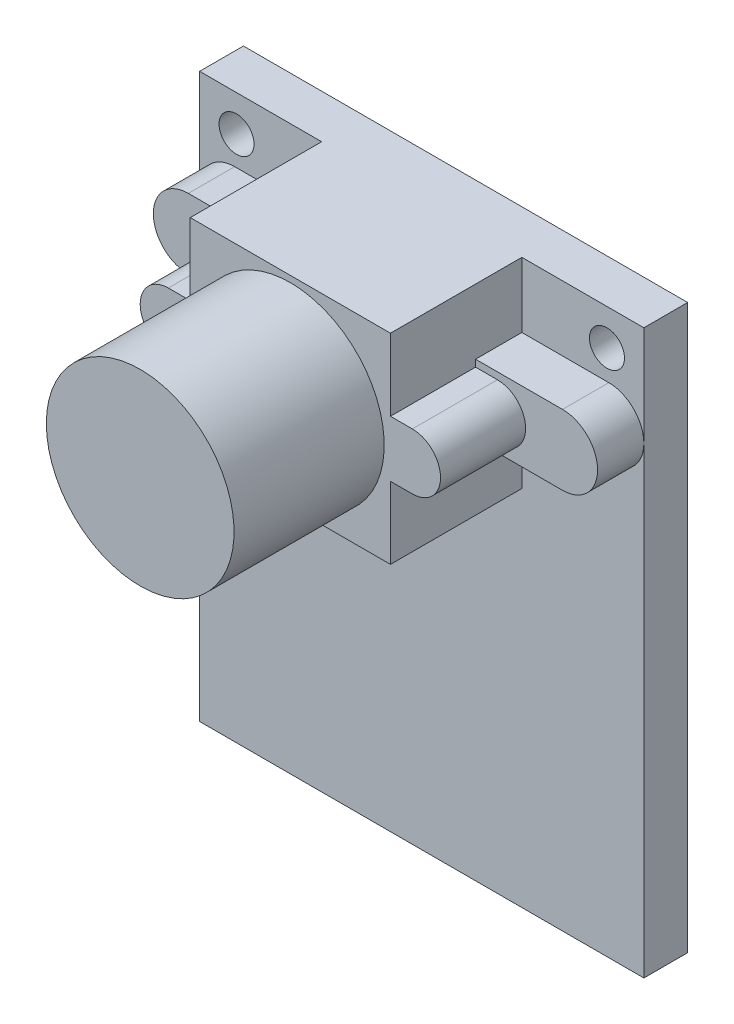
ISO-10303-21;
HEADER;
FILE_DESCRIPTION(('STEP AP214'),'2;1');
FILE_NAME('part.step','',(''),(''),'','','');
FILE_SCHEMA(('AUTOMOTIVE_DESIGN { 1 0 10303 214 1 1 1 1 }'));
ENDSEC;
DATA;
#1=APPLICATION_CONTEXT('core data for automotive mechanical design processes');
#2=APPLICATION_PROTOCOL_DEFINITION('international standard','automotive_design',2000,#1);
#3=PRODUCT_CONTEXT('',#1,'mechanical');
#4=PRODUCT('Part','Part','',(#3));
#5=PRODUCT_RELATED_PRODUCT_CATEGORY('part','',(#4));
#6=PRODUCT_DEFINITION_FORMATION('','',#4);
#7=PRODUCT_DEFINITION_CONTEXT('part definition',#1,'design');
#8=PRODUCT_DEFINITION('design','',#6,#7);
#9=PRODUCT_DEFINITION_SHAPE('','',#8);
#10=(LENGTH_UNIT() NAMED_UNIT(*) SI_UNIT(.MILLI.,.METRE.));
#11=(NAMED_UNIT(*) PLANE_ANGLE_UNIT() SI_UNIT($,.RADIAN.));
#12=(NAMED_UNIT(*) SI_UNIT($,.STERADIAN.) SOLID_ANGLE_UNIT());
#13=UNCERTAINTY_MEASURE_WITH_UNIT(LENGTH_MEASURE(1.E-05),#10,'distance_accuracy_value','');
#14=(GEOMETRIC_REPRESENTATION_CONTEXT(3) GLOBAL_UNCERTAINTY_ASSIGNED_CONTEXT((#13)) GLOBAL_UNIT_ASSIGNED_CONTEXT((#10,
#11,#12)) REPRESENTATION_CONTEXT('',''));
#15=CARTESIAN_POINT('',(0.,0.,0.));
#16=DIRECTION('',(0.,0.,1.));
#17=DIRECTION('',(1.,0.,0.));
#18=AXIS2_PLACEMENT_3D('',#15,#16,#17);
#19=CARTESIAN_POINT('',(0.,0.,3.5));
#20=DIRECTION('',(0.,0.,1.));
#21=DIRECTION('',(1.,0.,0.));
#22=AXIS2_PLACEMENT_3D('',#19,#20,#21);
#23=PLANE('',#22);
#24=CARTESIAN_POINT('',(14.95,14.5,3.5));
#25=DIRECTION('',(0.,0.,1.));
#26=DIRECTION('',(1.,0.,0.));
#27=AXIS2_PLACEMENT_3D('',#24,#25,#26);
#28=CIRCLE('',#27,2.8);
#29=CARTESIAN_POINT('',(17.75,14.5,3.5));
#30=VERTEX_POINT('',#29);
#31=CARTESIAN_POINT('',(14.95,11.7,3.5));
#32=VERTEX_POINT('',#31);
#33=EDGE_CURVE('E303',#30,#32,#28,.F.);
#34=ORIENTED_EDGE('',*,*,#33,.T.);
#35=DIRECTION('',(-1.,0.,0.));
#36=VECTOR('',#35,1.);
#37=CARTESIAN_POINT('',(0.,11.7,3.5));
#38=LINE('',#37,#36);
#39=CARTESIAN_POINT('',(8.,11.7,3.5));
#40=VERTEX_POINT('',#39);
#41=EDGE_CURVE('E240',#32,#40,#38,.T.);
#42=ORIENTED_EDGE('',*,*,#41,.T.);
#43=DIRECTION('',(0.,1.,0.));
#44=VECTOR('',#43,1.);
#45=CARTESIAN_POINT('',(8.,0.,3.5));
#46=LINE('',#45,#44);
#47=CARTESIAN_POINT('',(8.,6.50000000000001,3.5));
#48=VERTEX_POINT('',#47);
#49=EDGE_CURVE('E352',#48,#40,#46,.T.);
#50=ORIENTED_EDGE('',*,*,#49,.F.);
#51=DIRECTION('',(-1.,0.,0.));
#52=VECTOR('',#51,1.);
#53=CARTESIAN_POINT('',(0.,6.50000000000001,3.5));
#54=LINE('',#53,#52);
#55=CARTESIAN_POINT('',(-7.99999999999999,6.50000000000001,3.5));
#56=VERTEX_POINT('',#55);
#57=EDGE_CURVE('E399',#48,#56,#54,.T.);
#58=ORIENTED_EDGE('',*,*,#57,.T.);
#59=DIRECTION('',(0.,1.,0.));
#60=VECTOR('',#59,1.);
#61=CARTESIAN_POINT('',(-7.99999999999999,0.,3.5));
#62=LINE('',#61,#60);
#63=CARTESIAN_POINT('',(-7.99999999999999,11.7,3.5));
#64=VERTEX_POINT('',#63);
#65=EDGE_CURVE('E403',#56,#64,#62,.T.);
#66=ORIENTED_EDGE('',*,*,#65,.T.);
#67=DIRECTION('',(-1.,0.,0.));
#68=VECTOR('',#67,1.);
#69=CARTESIAN_POINT('',(0.,11.7,3.5));
#70=LINE('',#69,#68);
#71=CARTESIAN_POINT('',(-14.95,11.7,3.5));
#72=VERTEX_POINT('',#71);
#73=EDGE_CURVE('E245',#64,#72,#70,.T.);
#74=ORIENTED_EDGE('',*,*,#73,.T.);
#75=CARTESIAN_POINT('',(-14.95,14.5,3.5));
#76=DIRECTION('',(0.,0.,1.));
#77=DIRECTION('',(1.,0.,0.));
#78=AXIS2_PLACEMENT_3D('',#75,#76,#77);
#79=CIRCLE('',#78,2.8);
#80=CARTESIAN_POINT('',(-17.75,14.5,3.5));
#81=VERTEX_POINT('',#80);
#82=EDGE_CURVE('E302',#72,#81,#79,.F.);
#83=ORIENTED_EDGE('',*,*,#82,.T.);
#84=DIRECTION('',(0.,-1.,0.));
#85=VECTOR('',#84,1.);
#86=CARTESIAN_POINT('',(-17.75,22.5,3.5));
#87=LINE('',#86,#85);
#88=CARTESIAN_POINT('',(-17.75,-22.5,3.5));
#89=VERTEX_POINT('',#88);
#90=EDGE_CURVE('E424',#81,#89,#87,.T.);
#91=ORIENTED_EDGE('',*,*,#90,.T.);
#92=DIRECTION('',(1.,0.,0.));
#93=VECTOR('',#92,1.);
#94=CARTESIAN_POINT('',(-17.75,-22.5,3.5));
#95=LINE('',#94,#93);
#96=CARTESIAN_POINT('',(17.75,-22.5,3.5));
#97=VERTEX_POINT('',#96);
#98=EDGE_CURVE('E429',#89,#97,#95,.T.);
#99=ORIENTED_EDGE('',*,*,#98,.T.);
#100=DIRECTION('',(0.,1.,0.));
#101=VECTOR('',#100,1.);
#102=CARTESIAN_POINT('',(17.75,22.5,3.5));
#103=LINE('',#102,#101);
#104=EDGE_CURVE('E414',#97,#30,#103,.T.);
#105=ORIENTED_EDGE('',*,*,#104,.T.);
#106=EDGE_LOOP('',(#34,#42,#50,#58,#66,#74,#83,#91,#99,#105));
#107=FACE_BOUND('',#106,.T.);
#108=ADVANCED_FACE('F45',(#107),#23,.T.);
#109=CARTESIAN_POINT('',(14.8,19.6265753356329,3.5));
#110=DIRECTION('',(0.,0.,1.));
#111=DIRECTION('',(1.,0.,0.));
#112=AXIS2_PLACEMENT_3D('',#109,#110,#111);
#113=CIRCLE('',#112,1.4);
#114=CARTESIAN_POINT('',(16.2,19.6265753356329,3.5));
#115=VERTEX_POINT('',#114);
#116=EDGE_CURVE('E609',#115,#115,#113,.F.);
#117=ORIENTED_EDGE('',*,*,#116,.T.);
#118=EDGE_LOOP('',(#117));
#119=FACE_BOUND('',#118,.T.);
#120=DIRECTION('',(-1.,0.,0.));
#121=VECTOR('',#120,1.);
#122=CARTESIAN_POINT('',(0.,17.3,3.5));
#123=LINE('',#122,#121);
#124=CARTESIAN_POINT('',(14.95,17.3,3.5));
#125=VERTEX_POINT('',#124);
#126=CARTESIAN_POINT('',(8.,17.3,3.5));
#127=VERTEX_POINT('',#126);
#128=EDGE_CURVE('E295',#125,#127,#123,.T.);
#129=ORIENTED_EDGE('',*,*,#128,.F.);
#130=EDGE_CURVE('E306',#125,#30,#28,.F.);
#131=ORIENTED_EDGE('',*,*,#130,.T.);
#132=CARTESIAN_POINT('',(17.75,22.5,3.5));
#133=VERTEX_POINT('',#132);
#134=EDGE_CURVE('E419',#30,#133,#103,.T.);
#135=ORIENTED_EDGE('',*,*,#134,.T.);
#136=DIRECTION('',(-1.,0.,0.));
#137=VECTOR('',#136,1.);
#138=CARTESIAN_POINT('',(-17.75,22.5,3.5));
#139=LINE('',#138,#137);
#140=CARTESIAN_POINT('',(8.,22.5,3.5));
#141=VERTEX_POINT('',#140);
#142=EDGE_CURVE('E420',#133,#141,#139,.T.);
#143=ORIENTED_EDGE('',*,*,#142,.T.);
#144=DIRECTION('',(0.,1.,0.));
#145=VECTOR('',#144,1.);
#146=CARTESIAN_POINT('',(8.,0.,3.5));
#147=LINE('',#146,#145);
#148=EDGE_CURVE('E410',#127,#141,#147,.T.);
#149=ORIENTED_EDGE('',*,*,#148,.F.);
#150=EDGE_LOOP('',(#129,#131,#135,#143,#149));
#151=FACE_BOUND('',#150,.T.);
#152=ADVANCED_FACE('F485',(#119,#151),#23,.T.);
#153=CARTESIAN_POINT('',(-7.99999999999999,0.,14.));
#154=DIRECTION('',(1.,0.,0.));
#155=DIRECTION('',(0.,1.,0.));
#156=AXIS2_PLACEMENT_3D('',#153,#154,#155);
#157=PLANE('',#156);
#158=DIRECTION('',(0.,0.,-1.));
#159=VECTOR('',#158,1.);
#160=CARTESIAN_POINT('',(-7.99999999999999,11.7,7.2));
#161=LINE('',#160,#159);
#162=CARTESIAN_POINT('',(-7.99999999999999,11.7,7.2));
#163=VERTEX_POINT('',#162);
#164=EDGE_CURVE('E62',#163,#64,#161,.T.);
#165=ORIENTED_EDGE('',*,*,#164,.T.);
#166=ORIENTED_EDGE('',*,*,#65,.F.);
#167=DIRECTION('',(0.,0.,-1.));
#168=VECTOR('',#167,1.);
#169=CARTESIAN_POINT('',(-7.99999999999999,6.50000000000001,14.));
#170=LINE('',#169,#168);
#171=CARTESIAN_POINT('',(-7.99999999999999,6.50000000000001,14.));
#172=VERTEX_POINT('',#171);
#173=EDGE_CURVE('E377',#172,#56,#170,.T.);
#174=ORIENTED_EDGE('',*,*,#173,.F.);
#175=DIRECTION('',(0.,-1.,0.));
#176=VECTOR('',#175,1.);
#177=CARTESIAN_POINT('',(-7.99999999999999,0.,14.));
#178=LINE('',#177,#176);
#179=CARTESIAN_POINT('',(-8.,12.25,14.));
#180=VERTEX_POINT('',#179);
#181=EDGE_CURVE('E324',#180,#172,#178,.T.);
#182=ORIENTED_EDGE('',*,*,#181,.F.);
#183=DIRECTION('',(0.,0.,-1.));
#184=VECTOR('',#183,1.);
#185=CARTESIAN_POINT('',(-8.,12.25,14.));
#186=LINE('',#185,#184);
#187=CARTESIAN_POINT('',(-8.,12.25,7.2));
#188=VERTEX_POINT('',#187);
#189=EDGE_CURVE('E373',#180,#188,#186,.T.);
#190=ORIENTED_EDGE('',*,*,#189,.T.);
#191=DIRECTION('',(0.,1.,0.));
#192=VECTOR('',#191,1.);
#193=CARTESIAN_POINT('',(-7.99999999999999,0.,7.2));
#194=LINE('',#193,#192);
#195=EDGE_CURVE('E274',#163,#188,#194,.T.);
#196=ORIENTED_EDGE('',*,*,#195,.F.);
#197=EDGE_LOOP('',(#165,#166,#174,#182,#190,#196));
#198=FACE_BOUND('',#197,.T.);
#199=ADVANCED_FACE('F542',(#198),#157,.F.);
#200=CARTESIAN_POINT('',(8.,0.,14.));
#201=DIRECTION('',(1.,0.,0.));
#202=DIRECTION('',(0.,0.,-1.));
#203=AXIS2_PLACEMENT_3D('',#200,#201,#202);
#204=PLANE('',#203);
#205=ORIENTED_EDGE('',*,*,#49,.T.);
#206=DIRECTION('',(0.,0.,-1.));
#207=VECTOR('',#206,1.);
#208=CARTESIAN_POINT('',(8.,11.7,7.2));
#209=LINE('',#208,#207);
#210=CARTESIAN_POINT('',(8.,11.7,7.2));
#211=VERTEX_POINT('',#210);
#212=EDGE_CURVE('E508',#211,#40,#209,.T.);
#213=ORIENTED_EDGE('',*,*,#212,.F.);
#214=DIRECTION('',(0.,-1.,0.));
#215=VECTOR('',#214,1.);
#216=CARTESIAN_POINT('',(8.,0.,7.2));
#217=LINE('',#216,#215);
#218=CARTESIAN_POINT('',(8.,12.25,7.2));
#219=VERTEX_POINT('',#218);
#220=EDGE_CURVE('E232',#219,#211,#217,.T.);
#221=ORIENTED_EDGE('',*,*,#220,.F.);
#222=DIRECTION('',(0.,0.,-1.));
#223=VECTOR('',#222,1.);
#224=CARTESIAN_POINT('',(8.,12.25,14.));
#225=LINE('',#224,#223);
#226=CARTESIAN_POINT('',(8.,12.25,14.));
#227=VERTEX_POINT('',#226);
#228=EDGE_CURVE('E385',#227,#219,#225,.T.);
#229=ORIENTED_EDGE('',*,*,#228,.F.);
#230=DIRECTION('',(0.,-1.,0.));
#231=VECTOR('',#230,1.);
#232=CARTESIAN_POINT('',(8.,0.,14.));
#233=LINE('',#232,#231);
#234=CARTESIAN_POINT('',(8.,6.50000000000001,14.));
#235=VERTEX_POINT('',#234);
#236=EDGE_CURVE('E317',#227,#235,#233,.T.);
#237=ORIENTED_EDGE('',*,*,#236,.T.);
#238=DIRECTION('',(0.,0.,-1.));
#239=VECTOR('',#238,1.);
#240=CARTESIAN_POINT('',(8.,6.50000000000001,14.));
#241=LINE('',#240,#239);
#242=EDGE_CURVE('E381',#235,#48,#241,.T.);
#243=ORIENTED_EDGE('',*,*,#242,.T.);
#244=EDGE_LOOP('',(#205,#213,#221,#229,#237,#243));
#245=FACE_BOUND('',#244,.T.);
#246=ADVANCED_FACE('F533',(#245),#204,.T.);
#247=CARTESIAN_POINT('',(-14.8,19.6265753356329,3.5));
#248=DIRECTION('',(0.,0.,1.));
#249=DIRECTION('',(1.,0.,0.));
#250=AXIS2_PLACEMENT_3D('',#247,#248,#249);
#251=CIRCLE('',#250,1.4);
#252=CARTESIAN_POINT('',(-13.4,19.6265753356329,3.5));
#253=VERTEX_POINT('',#252);
#254=EDGE_CURVE('E606',#253,#253,#251,.F.);
#255=ORIENTED_EDGE('',*,*,#254,.T.);
#256=EDGE_LOOP('',(#255));
#257=FACE_BOUND('',#256,.T.);
#258=DIRECTION('',(-1.,0.,0.));
#259=VECTOR('',#258,1.);
#260=CARTESIAN_POINT('',(0.,17.3,3.5));
#261=LINE('',#260,#259);
#262=CARTESIAN_POINT('',(-8.,17.3,3.5));
#263=VERTEX_POINT('',#262);
#264=CARTESIAN_POINT('',(-14.95,17.3,3.5));
#265=VERTEX_POINT('',#264);
#266=EDGE_CURVE('E292',#263,#265,#261,.T.);
#267=ORIENTED_EDGE('',*,*,#266,.F.);
#268=DIRECTION('',(0.,1.,0.));
#269=VECTOR('',#268,1.);
#270=CARTESIAN_POINT('',(-7.99999999999999,0.,3.5));
#271=LINE('',#270,#269);
#272=CARTESIAN_POINT('',(-8.,22.5,3.5));
#273=VERTEX_POINT('',#272);
#274=EDGE_CURVE('E407',#263,#273,#271,.T.);
#275=ORIENTED_EDGE('',*,*,#274,.T.);
#276=CARTESIAN_POINT('',(-17.75,22.5,3.5));
#277=VERTEX_POINT('',#276);
#278=EDGE_CURVE('E418',#273,#277,#139,.T.);
#279=ORIENTED_EDGE('',*,*,#278,.T.);
#280=EDGE_CURVE('E425',#277,#81,#87,.T.);
#281=ORIENTED_EDGE('',*,*,#280,.T.);
#282=EDGE_CURVE('E298',#81,#265,#79,.F.);
#283=ORIENTED_EDGE('',*,*,#282,.T.);
#284=EDGE_LOOP('',(#267,#275,#279,#281,#283));
#285=FACE_BOUND('',#284,.T.);
#286=ADVANCED_FACE('F586',(#257,#285),#23,.T.);
#287=CARTESIAN_POINT('',(17.75,22.5,3.5));
#288=DIRECTION('',(-1.,0.,0.));
#289=DIRECTION('',(0.,-1.,0.));
#290=AXIS2_PLACEMENT_3D('',#287,#288,#289);
#291=PLANE('',#290);
#292=DIRECTION('',(0.,1.,0.));
#293=VECTOR('',#292,1.);
#294=CARTESIAN_POINT('',(17.75,22.5,0.));
#295=LINE('',#294,#293);
#296=CARTESIAN_POINT('',(17.75,-22.5,0.));
#297=VERTEX_POINT('',#296);
#298=CARTESIAN_POINT('',(17.75,22.5,0.));
#299=VERTEX_POINT('',#298);
#300=EDGE_CURVE('E413',#297,#299,#295,.T.);
#301=ORIENTED_EDGE('',*,*,#300,.T.);
#302=DIRECTION('',(0.,0.,-1.));
#303=VECTOR('',#302,1.);
#304=CARTESIAN_POINT('',(17.75,22.5,3.5));
#305=LINE('',#304,#303);
#306=EDGE_CURVE('E11',#133,#299,#305,.T.);
#307=ORIENTED_EDGE('',*,*,#306,.F.);
#308=ORIENTED_EDGE('',*,*,#134,.F.);
#309=ORIENTED_EDGE('',*,*,#104,.F.);
#310=DIRECTION('',(0.,0.,-1.));
#311=VECTOR('',#310,1.);
#312=CARTESIAN_POINT('',(17.75,-22.5,3.5));
#313=LINE('',#312,#311);
#314=EDGE_CURVE('E432',#97,#297,#313,.T.);
#315=ORIENTED_EDGE('',*,*,#314,.T.);
#316=EDGE_LOOP('',(#301,#307,#308,#309,#315));
#317=FACE_BOUND('',#316,.T.);
#318=ADVANCED_FACE('F47',(#317),#291,.F.);
#319=CARTESIAN_POINT('',(-17.75,22.5,3.5));
#320=DIRECTION('',(0.,-1.,0.));
#321=DIRECTION('',(0.,0.,-1.));
#322=AXIS2_PLACEMENT_3D('',#319,#320,#321);
#323=PLANE('',#322);
#324=DIRECTION('',(-1.,0.,0.));
#325=VECTOR('',#324,1.);
#326=CARTESIAN_POINT('',(-17.75,22.5,0.));
#327=LINE('',#326,#325);
#328=CARTESIAN_POINT('',(-17.75,22.5,0.));
#329=VERTEX_POINT('',#328);
#330=EDGE_CURVE('E435',#299,#329,#327,.T.);
#331=ORIENTED_EDGE('',*,*,#330,.T.);
#332=DIRECTION('',(0.,0.,-1.));
#333=VECTOR('',#332,1.);
#334=CARTESIAN_POINT('',(-17.75,22.5,3.5));
#335=LINE('',#334,#333);
#336=EDGE_CURVE('E55',#277,#329,#335,.T.);
#337=ORIENTED_EDGE('',*,*,#336,.F.);
#338=ORIENTED_EDGE('',*,*,#278,.F.);
#339=DIRECTION('',(0.,0.,-1.));
#340=VECTOR('',#339,1.);
#341=CARTESIAN_POINT('',(-8.,22.5,14.));
#342=LINE('',#341,#340);
#343=CARTESIAN_POINT('',(-8.,22.5,14.));
#344=VERTEX_POINT('',#343);
#345=EDGE_CURVE('E357',#344,#273,#342,.T.);
#346=ORIENTED_EDGE('',*,*,#345,.F.);
#347=DIRECTION('',(-1.,0.,0.));
#348=VECTOR('',#347,1.);
#349=CARTESIAN_POINT('',(0.,22.5,14.));
#350=LINE('',#349,#348);
#351=CARTESIAN_POINT('',(8.,22.5,14.));
#352=VERTEX_POINT('',#351);
#353=EDGE_CURVE('E340',#352,#344,#350,.T.);
#354=ORIENTED_EDGE('',*,*,#353,.F.);
#355=DIRECTION('',(0.,0.,-1.));
#356=VECTOR('',#355,1.);
#357=CARTESIAN_POINT('',(8.,22.5,14.));
#358=LINE('',#357,#356);
#359=EDGE_CURVE('E353',#352,#141,#358,.T.);
#360=ORIENTED_EDGE('',*,*,#359,.T.);
#361=ORIENTED_EDGE('',*,*,#142,.F.);
#362=ORIENTED_EDGE('',*,*,#306,.T.);
#363=EDGE_LOOP('',(#331,#337,#338,#346,#354,#360,#361,#362));
#364=FACE_BOUND('',#363,.T.);
#365=ADVANCED_FACE('F513',(#364),#323,.F.);
#366=CARTESIAN_POINT('',(-17.75,22.5,3.5));
#367=DIRECTION('',(1.,0.,0.));
#368=DIRECTION('',(0.,1.,0.));
#369=AXIS2_PLACEMENT_3D('',#366,#367,#368);
#370=PLANE('',#369);
#371=DIRECTION('',(0.,-1.,0.));
#372=VECTOR('',#371,1.);
#373=CARTESIAN_POINT('',(-17.75,22.5,0.));
#374=LINE('',#373,#372);
#375=CARTESIAN_POINT('',(-17.75,-22.5,0.));
#376=VERTEX_POINT('',#375);
#377=EDGE_CURVE('E438',#329,#376,#374,.T.);
#378=ORIENTED_EDGE('',*,*,#377,.T.);
#379=DIRECTION('',(0.,0.,-1.));
#380=VECTOR('',#379,1.);
#381=CARTESIAN_POINT('',(-17.75,-22.5,3.5));
#382=LINE('',#381,#380);
#383=EDGE_CURVE('E447',#89,#376,#382,.T.);
#384=ORIENTED_EDGE('',*,*,#383,.F.);
#385=ORIENTED_EDGE('',*,*,#90,.F.);
#386=ORIENTED_EDGE('',*,*,#280,.F.);
#387=ORIENTED_EDGE('',*,*,#336,.T.);
#388=EDGE_LOOP('',(#378,#384,#385,#386,#387));
#389=FACE_BOUND('',#388,.T.);
#390=ADVANCED_FACE('F457',(#389),#370,.F.);
#391=CARTESIAN_POINT('',(-17.75,-22.5,3.5));
#392=DIRECTION('',(0.,1.,0.));
#393=DIRECTION('',(0.,0.,1.));
#394=AXIS2_PLACEMENT_3D('',#391,#392,#393);
#395=PLANE('',#394);
#396=DIRECTION('',(1.,0.,0.));
#397=VECTOR('',#396,1.);
#398=CARTESIAN_POINT('',(-17.75,-22.5,0.));
#399=LINE('',#398,#397);
#400=EDGE_CURVE('E441',#376,#297,#399,.T.);
#401=ORIENTED_EDGE('',*,*,#400,.T.);
#402=ORIENTED_EDGE('',*,*,#314,.F.);
#403=ORIENTED_EDGE('',*,*,#98,.F.);
#404=ORIENTED_EDGE('',*,*,#383,.T.);
#405=EDGE_LOOP('',(#401,#402,#403,#404));
#406=FACE_BOUND('',#405,.T.);
#407=ADVANCED_FACE('F469',(#406),#395,.F.);
#408=CARTESIAN_POINT('',(0.,0.,0.));
#409=DIRECTION('',(0.,0.,1.));
#410=DIRECTION('',(1.,0.,0.));
#411=AXIS2_PLACEMENT_3D('',#408,#409,#410);
#412=PLANE('',#411);
#413=CARTESIAN_POINT('',(14.8,19.6265753356329,0.));
#414=DIRECTION('',(0.,0.,-1.));
#415=DIRECTION('',(-1.,0.,0.));
#416=AXIS2_PLACEMENT_3D('',#413,#414,#415);
#417=CIRCLE('',#416,1.4);
#418=CARTESIAN_POINT('',(13.4,19.6265753356329,0.));
#419=VERTEX_POINT('',#418);
#420=EDGE_CURVE('E615',#419,#419,#417,.T.);
#421=ORIENTED_EDGE('',*,*,#420,.F.);
#422=EDGE_LOOP('',(#421));
#423=FACE_BOUND('',#422,.T.);
#424=CARTESIAN_POINT('',(-14.8,19.6265753356329,0.));
#425=DIRECTION('',(0.,0.,-1.));
#426=DIRECTION('',(1.,0.,0.));
#427=AXIS2_PLACEMENT_3D('',#424,#425,#426);
#428=CIRCLE('',#427,1.4);
#429=CARTESIAN_POINT('',(-13.4,19.6265753356329,0.));
#430=VERTEX_POINT('',#429);
#431=EDGE_CURVE('E610',#430,#430,#428,.T.);
#432=ORIENTED_EDGE('',*,*,#431,.F.);
#433=EDGE_LOOP('',(#432));
#434=FACE_BOUND('',#433,.T.);
#435=ORIENTED_EDGE('',*,*,#330,.F.);
#436=ORIENTED_EDGE('',*,*,#300,.F.);
#437=ORIENTED_EDGE('',*,*,#400,.F.);
#438=ORIENTED_EDGE('',*,*,#377,.F.);
#439=EDGE_LOOP('',(#435,#436,#437,#438));
#440=FACE_BOUND('',#439,.T.);
#441=ADVANCED_FACE('F465',(#423,#434,#440),#412,.F.);
#442=CARTESIAN_POINT('',(0.,16.75,14.));
#443=DIRECTION('',(0.,1.,0.));
#444=DIRECTION('',(-1.,0.,0.));
#445=AXIS2_PLACEMENT_3D('',#442,#443,#444);
#446=PLANE('',#445);
#447=DIRECTION('',(1.,0.,0.));
#448=VECTOR('',#447,1.);
#449=CARTESIAN_POINT('',(0.,16.75,7.2));
#450=LINE('',#449,#448);
#451=CARTESIAN_POINT('',(8.,16.75,7.2));
#452=VERTEX_POINT('',#451);
#453=CARTESIAN_POINT('',(9.75000000000001,16.75,7.2));
#454=VERTEX_POINT('',#453);
#455=EDGE_CURVE('E70',#452,#454,#450,.T.);
#456=ORIENTED_EDGE('',*,*,#455,.F.);
#457=DIRECTION('',(0.,0.,-1.));
#458=VECTOR('',#457,1.);
#459=CARTESIAN_POINT('',(8.,16.75,14.));
#460=LINE('',#459,#458);
#461=CARTESIAN_POINT('',(8.,16.75,14.));
#462=VERTEX_POINT('',#461);
#463=EDGE_CURVE('E348',#462,#452,#460,.T.);
#464=ORIENTED_EDGE('',*,*,#463,.F.);
#465=DIRECTION('',(1.,0.,0.));
#466=VECTOR('',#465,1.);
#467=CARTESIAN_POINT('',(0.,16.75,14.));
#468=LINE('',#467,#466);
#469=CARTESIAN_POINT('',(9.75000000000001,16.75,14.));
#470=VERTEX_POINT('',#469);
#471=EDGE_CURVE('E307',#462,#470,#468,.T.);
#472=ORIENTED_EDGE('',*,*,#471,.T.);
#473=DIRECTION('',(0.,0.,-1.));
#474=VECTOR('',#473,1.);
#475=CARTESIAN_POINT('',(9.75000000000001,16.75,14.));
#476=LINE('',#475,#474);
#477=EDGE_CURVE('E347',#470,#454,#476,.T.);
#478=ORIENTED_EDGE('',*,*,#477,.T.);
#479=EDGE_LOOP('',(#456,#464,#472,#478));
#480=FACE_BOUND('',#479,.T.);
#481=ADVANCED_FACE('F523',(#480),#446,.T.);
#482=CARTESIAN_POINT('',(8.,0.,14.));
#483=DIRECTION('',(1.,0.,0.));
#484=DIRECTION('',(0.,0.,-1.));
#485=AXIS2_PLACEMENT_3D('',#482,#483,#484);
#486=PLANE('',#485);
#487=DIRECTION('',(0.,0.,-1.));
#488=VECTOR('',#487,1.);
#489=CARTESIAN_POINT('',(8.,17.3,7.2));
#490=LINE('',#489,#488);
#491=CARTESIAN_POINT('',(8.,17.3,7.2));
#492=VERTEX_POINT('',#491);
#493=EDGE_CURVE('E247',#492,#127,#490,.T.);
#494=ORIENTED_EDGE('',*,*,#493,.T.);
#495=ORIENTED_EDGE('',*,*,#148,.T.);
#496=ORIENTED_EDGE('',*,*,#359,.F.);
#497=DIRECTION('',(0.,-1.,0.));
#498=VECTOR('',#497,1.);
#499=CARTESIAN_POINT('',(8.,0.,14.));
#500=LINE('',#499,#498);
#501=EDGE_CURVE('E343',#352,#462,#500,.T.);
#502=ORIENTED_EDGE('',*,*,#501,.T.);
#503=ORIENTED_EDGE('',*,*,#463,.T.);
#504=DIRECTION('',(0.,-1.,0.));
#505=VECTOR('',#504,1.);
#506=CARTESIAN_POINT('',(8.,0.,7.2));
#507=LINE('',#506,#505);
#508=EDGE_CURVE('E493',#492,#452,#507,.T.);
#509=ORIENTED_EDGE('',*,*,#508,.F.);
#510=EDGE_LOOP('',(#494,#495,#496,#502,#503,#509));
#511=FACE_BOUND('',#510,.T.);
#512=ADVANCED_FACE('F512',(#511),#486,.T.);
#513=CARTESIAN_POINT('',(-7.99999999999999,0.,14.));
#514=DIRECTION('',(1.,0.,0.));
#515=DIRECTION('',(0.,1.,0.));
#516=AXIS2_PLACEMENT_3D('',#513,#514,#515);
#517=PLANE('',#516);
#518=ORIENTED_EDGE('',*,*,#274,.F.);
#519=DIRECTION('',(0.,0.,-1.));
#520=VECTOR('',#519,1.);
#521=CARTESIAN_POINT('',(-8.,17.3,7.2));
#522=LINE('',#521,#520);
#523=CARTESIAN_POINT('',(-8.,17.3,7.2));
#524=VERTEX_POINT('',#523);
#525=EDGE_CURVE('E236',#524,#263,#522,.T.);
#526=ORIENTED_EDGE('',*,*,#525,.F.);
#527=DIRECTION('',(0.,1.,0.));
#528=VECTOR('',#527,1.);
#529=CARTESIAN_POINT('',(-7.99999999999999,0.,7.2));
#530=LINE('',#529,#528);
#531=CARTESIAN_POINT('',(-8.,16.75,7.2));
#532=VERTEX_POINT('',#531);
#533=EDGE_CURVE('E261',#532,#524,#530,.T.);
#534=ORIENTED_EDGE('',*,*,#533,.F.);
#535=DIRECTION('',(0.,0.,-1.));
#536=VECTOR('',#535,1.);
#537=CARTESIAN_POINT('',(-8.,16.75,14.));
#538=LINE('',#537,#536);
#539=CARTESIAN_POINT('',(-8.,16.75,14.));
#540=VERTEX_POINT('',#539);
#541=EDGE_CURVE('E361',#540,#532,#538,.T.);
#542=ORIENTED_EDGE('',*,*,#541,.F.);
#543=DIRECTION('',(0.,-1.,0.));
#544=VECTOR('',#543,1.);
#545=CARTESIAN_POINT('',(-7.99999999999999,0.,14.));
#546=LINE('',#545,#544);
#547=EDGE_CURVE('E337',#344,#540,#546,.T.);
#548=ORIENTED_EDGE('',*,*,#547,.F.);
#549=ORIENTED_EDGE('',*,*,#345,.T.);
#550=EDGE_LOOP('',(#518,#526,#534,#542,#548,#549));
#551=FACE_BOUND('',#550,.T.);
#552=ADVANCED_FACE('F564',(#551),#517,.F.);
#553=CARTESIAN_POINT('',(0.,16.75,14.));
#554=DIRECTION('',(0.,1.,0.));
#555=DIRECTION('',(-1.,0.,0.));
#556=AXIS2_PLACEMENT_3D('',#553,#554,#555);
#557=PLANE('',#556);
#558=DIRECTION('',(1.,0.,0.));
#559=VECTOR('',#558,1.);
#560=CARTESIAN_POINT('',(0.,16.75,7.2));
#561=LINE('',#560,#559);
#562=CARTESIAN_POINT('',(-9.75000000000001,16.75,7.2));
#563=VERTEX_POINT('',#562);
#564=EDGE_CURVE('E258',#563,#532,#561,.T.);
#565=ORIENTED_EDGE('',*,*,#564,.F.);
#566=DIRECTION('',(0.,0.,-1.));
#567=VECTOR('',#566,1.);
#568=CARTESIAN_POINT('',(-9.75000000000001,16.75,14.));
#569=LINE('',#568,#567);
#570=CARTESIAN_POINT('',(-9.75000000000001,16.75,14.));
#571=VERTEX_POINT('',#570);
#572=EDGE_CURVE('E365',#571,#563,#569,.T.);
#573=ORIENTED_EDGE('',*,*,#572,.F.);
#574=DIRECTION('',(1.,0.,0.));
#575=VECTOR('',#574,1.);
#576=CARTESIAN_POINT('',(0.,16.75,14.));
#577=LINE('',#576,#575);
#578=EDGE_CURVE('E333',#571,#540,#577,.T.);
#579=ORIENTED_EDGE('',*,*,#578,.T.);
#580=ORIENTED_EDGE('',*,*,#541,.T.);
#581=EDGE_LOOP('',(#565,#573,#579,#580));
#582=FACE_BOUND('',#581,.T.);
#583=ADVANCED_FACE('F559',(#582),#557,.T.);
#584=CARTESIAN_POINT('',(-9.75000000000001,14.5,14.));
#585=DIRECTION('',(0.,0.,-1.));
#586=DIRECTION('',(-1.,0.,0.));
#587=AXIS2_PLACEMENT_3D('',#584,#585,#586);
#588=CYLINDRICAL_SURFACE('',#587,2.25000000000001);
#589=ORIENTED_EDGE('',*,*,#572,.T.);
#590=CARTESIAN_POINT('',(-9.75000000000001,14.5,7.2));
#591=DIRECTION('',(0.,0.,1.));
#592=DIRECTION('',(1.,0.,0.));
#593=AXIS2_PLACEMENT_3D('',#590,#591,#592);
#594=CIRCLE('',#593,2.25000000000001);
#595=CARTESIAN_POINT('',(-9.75000000000001,12.25,7.2));
#596=VERTEX_POINT('',#595);
#597=EDGE_CURVE('E254',#563,#596,#594,.T.);
#598=ORIENTED_EDGE('',*,*,#597,.T.);
#599=DIRECTION('',(0.,0.,-1.));
#600=VECTOR('',#599,1.);
#601=CARTESIAN_POINT('',(-9.75000000000001,12.25,14.));
#602=LINE('',#601,#600);
#603=CARTESIAN_POINT('',(-9.75000000000001,12.25,14.));
#604=VERTEX_POINT('',#603);
#605=EDGE_CURVE('E369',#604,#596,#602,.T.);
#606=ORIENTED_EDGE('',*,*,#605,.F.);
#607=CARTESIAN_POINT('',(-9.75000000000001,14.5,14.));
#608=DIRECTION('',(0.,0.,1.));
#609=DIRECTION('',(1.,0.,0.));
#610=AXIS2_PLACEMENT_3D('',#607,#608,#609);
#611=CIRCLE('',#610,2.25000000000001);
#612=EDGE_CURVE('E330',#571,#604,#611,.T.);
#613=ORIENTED_EDGE('',*,*,#612,.F.);
#614=EDGE_LOOP('',(#589,#598,#606,#613));
#615=FACE_BOUND('',#614,.T.);
#616=ADVANCED_FACE('F554',(#615),#588,.T.);
#617=CARTESIAN_POINT('',(0.,12.25,14.));
#618=DIRECTION('',(0.,1.,0.));
#619=DIRECTION('',(-1.,0.,0.));
#620=AXIS2_PLACEMENT_3D('',#617,#618,#619);
#621=PLANE('',#620);
#622=ORIENTED_EDGE('',*,*,#605,.T.);
#623=DIRECTION('',(-1.,0.,0.));
#624=VECTOR('',#623,1.);
#625=CARTESIAN_POINT('',(0.,12.25,7.2));
#626=LINE('',#625,#624);
#627=EDGE_CURVE('E251',#188,#596,#626,.T.);
#628=ORIENTED_EDGE('',*,*,#627,.F.);
#629=ORIENTED_EDGE('',*,*,#189,.F.);
#630=DIRECTION('',(1.,0.,0.));
#631=VECTOR('',#630,1.);
#632=CARTESIAN_POINT('',(0.,12.25,14.));
#633=LINE('',#632,#631);
#634=EDGE_CURVE('E327',#604,#180,#633,.T.);
#635=ORIENTED_EDGE('',*,*,#634,.F.);
#636=EDGE_LOOP('',(#622,#628,#629,#635));
#637=FACE_BOUND('',#636,.T.);
#638=ADVANCED_FACE('F549',(#637),#621,.F.);
#639=CARTESIAN_POINT('',(0.,6.50000000000001,14.));
#640=DIRECTION('',(0.,1.,0.));
#641=DIRECTION('',(-1.,0.,0.));
#642=AXIS2_PLACEMENT_3D('',#639,#640,#641);
#643=PLANE('',#642);
#644=ORIENTED_EDGE('',*,*,#57,.F.);
#645=ORIENTED_EDGE('',*,*,#242,.F.);
#646=DIRECTION('',(1.,0.,0.));
#647=VECTOR('',#646,1.);
#648=CARTESIAN_POINT('',(0.,6.50000000000001,14.));
#649=LINE('',#648,#647);
#650=EDGE_CURVE('E321',#172,#235,#649,.T.);
#651=ORIENTED_EDGE('',*,*,#650,.F.);
#652=ORIENTED_EDGE('',*,*,#173,.T.);
#653=EDGE_LOOP('',(#644,#645,#651,#652));
#654=FACE_BOUND('',#653,.T.);
#655=ADVANCED_FACE('F537',(#654),#643,.F.);
#656=CARTESIAN_POINT('',(0.,12.25,14.));
#657=DIRECTION('',(0.,1.,0.));
#658=DIRECTION('',(-1.,0.,0.));
#659=AXIS2_PLACEMENT_3D('',#656,#657,#658);
#660=PLANE('',#659);
#661=ORIENTED_EDGE('',*,*,#228,.T.);
#662=DIRECTION('',(-1.,0.,0.));
#663=VECTOR('',#662,1.);
#664=CARTESIAN_POINT('',(0.,12.25,7.2));
#665=LINE('',#664,#663);
#666=CARTESIAN_POINT('',(9.75000000000001,12.25,7.2));
#667=VERTEX_POINT('',#666);
#668=EDGE_CURVE('E503',#667,#219,#665,.T.);
#669=ORIENTED_EDGE('',*,*,#668,.F.);
#670=DIRECTION('',(0.,0.,-1.));
#671=VECTOR('',#670,1.);
#672=CARTESIAN_POINT('',(9.75000000000001,12.25,14.));
#673=LINE('',#672,#671);
#674=CARTESIAN_POINT('',(9.75000000000001,12.25,14.));
#675=VERTEX_POINT('',#674);
#676=EDGE_CURVE('E389',#675,#667,#673,.T.);
#677=ORIENTED_EDGE('',*,*,#676,.F.);
#678=DIRECTION('',(1.,0.,0.));
#679=VECTOR('',#678,1.);
#680=CARTESIAN_POINT('',(0.,12.25,14.));
#681=LINE('',#680,#679);
#682=EDGE_CURVE('E314',#227,#675,#681,.T.);
#683=ORIENTED_EDGE('',*,*,#682,.F.);
#684=EDGE_LOOP('',(#661,#669,#677,#683));
#685=FACE_BOUND('',#684,.T.);
#686=ADVANCED_FACE('F529',(#685),#660,.F.);
#687=CARTESIAN_POINT('',(9.74999999999999,14.5,14.));
#688=DIRECTION('',(0.,0.,-1.));
#689=DIRECTION('',(-1.,0.,0.));
#690=AXIS2_PLACEMENT_3D('',#687,#688,#689);
#691=CYLINDRICAL_SURFACE('',#690,2.25000000000001);
#692=ORIENTED_EDGE('',*,*,#676,.T.);
#693=CARTESIAN_POINT('',(9.74999999999999,14.5,7.2));
#694=DIRECTION('',(0.,0.,1.));
#695=DIRECTION('',(1.,0.,0.));
#696=AXIS2_PLACEMENT_3D('',#693,#694,#695);
#697=CIRCLE('',#696,2.25000000000001);
#698=EDGE_CURVE('E500',#667,#454,#697,.T.);
#699=ORIENTED_EDGE('',*,*,#698,.T.);
#700=ORIENTED_EDGE('',*,*,#477,.F.);
#701=CARTESIAN_POINT('',(9.74999999999999,14.5,14.));
#702=DIRECTION('',(0.,0.,1.));
#703=DIRECTION('',(1.,0.,0.));
#704=AXIS2_PLACEMENT_3D('',#701,#702,#703);
#705=CIRCLE('',#704,2.25000000000001);
#706=EDGE_CURVE('E311',#675,#470,#705,.T.);
#707=ORIENTED_EDGE('',*,*,#706,.F.);
#708=EDGE_LOOP('',(#692,#699,#700,#707));
#709=FACE_BOUND('',#708,.T.);
#710=ADVANCED_FACE('F525',(#709),#691,.T.);
#711=CARTESIAN_POINT('',(9.74999999999999,14.5,14.));
#712=DIRECTION('',(0.,0.,1.));
#713=DIRECTION('',(1.,0.,0.));
#714=AXIS2_PLACEMENT_3D('',#711,#712,#713);
#715=PLANE('',#714);
#716=CARTESIAN_POINT('',(0.,14.5,14.));
#717=DIRECTION('',(0.,0.,1.));
#718=DIRECTION('',(1.,0.,0.));
#719=AXIS2_PLACEMENT_3D('',#716,#717,#718);
#720=CIRCLE('',#719,7.5);
#721=CARTESIAN_POINT('',(-7.5,14.5,14.));
#722=VERTEX_POINT('',#721);
#723=EDGE_CURVE('E49',#722,#722,#720,.F.);
#724=ORIENTED_EDGE('',*,*,#723,.T.);
#725=EDGE_LOOP('',(#724));
#726=FACE_BOUND('',#725,.T.);
#727=ORIENTED_EDGE('',*,*,#471,.F.);
#728=ORIENTED_EDGE('',*,*,#501,.F.);
#729=ORIENTED_EDGE('',*,*,#353,.T.);
#730=ORIENTED_EDGE('',*,*,#547,.T.);
#731=ORIENTED_EDGE('',*,*,#578,.F.);
#732=ORIENTED_EDGE('',*,*,#612,.T.);
#733=ORIENTED_EDGE('',*,*,#634,.T.);
#734=ORIENTED_EDGE('',*,*,#181,.T.);
#735=ORIENTED_EDGE('',*,*,#650,.T.);
#736=ORIENTED_EDGE('',*,*,#236,.F.);
#737=ORIENTED_EDGE('',*,*,#682,.T.);
#738=ORIENTED_EDGE('',*,*,#706,.T.);
#739=EDGE_LOOP('',(#727,#728,#729,#730,#731,#732,#733,#734,#735,#736,#737,#738));
#740=FACE_BOUND('',#739,.T.);
#741=ADVANCED_FACE('F519',(#726,#740),#715,.T.);
#742=CARTESIAN_POINT('',(0.,11.7,7.2));
#743=DIRECTION('',(0.,1.,0.));
#744=DIRECTION('',(0.,0.,1.));
#745=AXIS2_PLACEMENT_3D('',#742,#743,#744);
#746=PLANE('',#745);
#747=ORIENTED_EDGE('',*,*,#41,.F.);
#748=DIRECTION('',(0.,0.,-1.));
#749=VECTOR('',#748,1.);
#750=CARTESIAN_POINT('',(14.95,11.7,7.2));
#751=LINE('',#750,#749);
#752=CARTESIAN_POINT('',(14.95,11.7,7.2));
#753=VERTEX_POINT('',#752);
#754=EDGE_CURVE('E219',#753,#32,#751,.T.);
#755=ORIENTED_EDGE('',*,*,#754,.F.);
#756=DIRECTION('',(1.,0.,0.));
#757=VECTOR('',#756,1.);
#758=CARTESIAN_POINT('',(0.,11.7,7.2));
#759=LINE('',#758,#757);
#760=EDGE_CURVE('E227',#211,#753,#759,.T.);
#761=ORIENTED_EDGE('',*,*,#760,.F.);
#762=ORIENTED_EDGE('',*,*,#212,.T.);
#763=EDGE_LOOP('',(#747,#755,#761,#762));
#764=FACE_BOUND('',#763,.T.);
#765=ADVANCED_FACE('F238',(#764),#746,.F.);
#766=CARTESIAN_POINT('',(14.95,14.5,7.2));
#767=DIRECTION('',(0.,0.,-1.));
#768=DIRECTION('',(-1.,0.,0.));
#769=AXIS2_PLACEMENT_3D('',#766,#767,#768);
#770=CYLINDRICAL_SURFACE('',#769,2.8);
#771=ORIENTED_EDGE('',*,*,#130,.F.);
#772=DIRECTION('',(0.,0.,-1.));
#773=VECTOR('',#772,1.);
#774=CARTESIAN_POINT('',(14.95,17.3,7.2));
#775=LINE('',#774,#773);
#776=CARTESIAN_POINT('',(14.95,17.3,7.2));
#777=VERTEX_POINT('',#776);
#778=EDGE_CURVE('E222',#777,#125,#775,.T.);
#779=ORIENTED_EDGE('',*,*,#778,.F.);
#780=CARTESIAN_POINT('',(14.95,14.5,7.2));
#781=DIRECTION('',(0.,0.,1.));
#782=DIRECTION('',(1.,0.,0.));
#783=AXIS2_PLACEMENT_3D('',#780,#781,#782);
#784=CIRCLE('',#783,2.8);
#785=EDGE_CURVE('E215',#753,#777,#784,.T.);
#786=ORIENTED_EDGE('',*,*,#785,.F.);
#787=ORIENTED_EDGE('',*,*,#754,.T.);
#788=ORIENTED_EDGE('',*,*,#33,.F.);
#789=EDGE_LOOP('',(#771,#779,#786,#787,#788));
#790=FACE_BOUND('',#789,.T.);
#791=ADVANCED_FACE('F217',(#790),#770,.T.);
#792=CARTESIAN_POINT('',(0.,17.3,7.2));
#793=DIRECTION('',(0.,1.,0.));
#794=DIRECTION('',(0.,0.,1.));
#795=AXIS2_PLACEMENT_3D('',#792,#793,#794);
#796=PLANE('',#795);
#797=ORIENTED_EDGE('',*,*,#778,.T.);
#798=ORIENTED_EDGE('',*,*,#128,.T.);
#799=ORIENTED_EDGE('',*,*,#493,.F.);
#800=DIRECTION('',(1.,0.,0.));
#801=VECTOR('',#800,1.);
#802=CARTESIAN_POINT('',(0.,17.3,7.2));
#803=LINE('',#802,#801);
#804=EDGE_CURVE('E226',#492,#777,#803,.T.);
#805=ORIENTED_EDGE('',*,*,#804,.T.);
#806=EDGE_LOOP('',(#797,#798,#799,#805));
#807=FACE_BOUND('',#806,.T.);
#808=ADVANCED_FACE('F489',(#807),#796,.T.);
#809=CARTESIAN_POINT('',(14.95,14.5,7.2));
#810=DIRECTION('',(0.,0.,1.));
#811=DIRECTION('',(1.,0.,0.));
#812=AXIS2_PLACEMENT_3D('',#809,#810,#811);
#813=PLANE('',#812);
#814=ORIENTED_EDGE('',*,*,#760,.T.);
#815=ORIENTED_EDGE('',*,*,#785,.T.);
#816=ORIENTED_EDGE('',*,*,#804,.F.);
#817=ORIENTED_EDGE('',*,*,#508,.T.);
#818=ORIENTED_EDGE('',*,*,#455,.T.);
#819=ORIENTED_EDGE('',*,*,#698,.F.);
#820=ORIENTED_EDGE('',*,*,#668,.T.);
#821=ORIENTED_EDGE('',*,*,#220,.T.);
#822=EDGE_LOOP('',(#814,#815,#816,#817,#818,#819,#820,#821));
#823=FACE_BOUND('',#822,.T.);
#824=ADVANCED_FACE('F230',(#823),#813,.T.);
#825=CARTESIAN_POINT('',(0.,17.3,7.2));
#826=DIRECTION('',(0.,1.,0.));
#827=DIRECTION('',(0.,0.,1.));
#828=AXIS2_PLACEMENT_3D('',#825,#826,#827);
#829=PLANE('',#828);
#830=ORIENTED_EDGE('',*,*,#525,.T.);
#831=ORIENTED_EDGE('',*,*,#266,.T.);
#832=DIRECTION('',(0.,0.,-1.));
#833=VECTOR('',#832,1.);
#834=CARTESIAN_POINT('',(-14.95,17.3,7.2));
#835=LINE('',#834,#833);
#836=CARTESIAN_POINT('',(-14.95,17.3,7.2));
#837=VERTEX_POINT('',#836);
#838=EDGE_CURVE('E283',#837,#265,#835,.T.);
#839=ORIENTED_EDGE('',*,*,#838,.F.);
#840=DIRECTION('',(1.,0.,0.));
#841=VECTOR('',#840,1.);
#842=CARTESIAN_POINT('',(0.,17.3,7.2));
#843=LINE('',#842,#841);
#844=EDGE_CURVE('E264',#837,#524,#843,.T.);
#845=ORIENTED_EDGE('',*,*,#844,.T.);
#846=EDGE_LOOP('',(#830,#831,#839,#845));
#847=FACE_BOUND('',#846,.T.);
#848=ADVANCED_FACE('F568',(#847),#829,.T.);
#849=CARTESIAN_POINT('',(-14.95,14.5,7.2));
#850=DIRECTION('',(0.,0.,-1.));
#851=DIRECTION('',(-1.,0.,0.));
#852=AXIS2_PLACEMENT_3D('',#849,#850,#851);
#853=CYLINDRICAL_SURFACE('',#852,2.8);
#854=ORIENTED_EDGE('',*,*,#82,.F.);
#855=DIRECTION('',(0.,0.,-1.));
#856=VECTOR('',#855,1.);
#857=CARTESIAN_POINT('',(-14.95,11.7,7.2));
#858=LINE('',#857,#856);
#859=CARTESIAN_POINT('',(-14.95,11.7,7.2));
#860=VERTEX_POINT('',#859);
#861=EDGE_CURVE('E279',#860,#72,#858,.T.);
#862=ORIENTED_EDGE('',*,*,#861,.F.);
#863=CARTESIAN_POINT('',(-14.95,14.5,7.2));
#864=DIRECTION('',(0.,0.,1.));
#865=DIRECTION('',(1.,0.,0.));
#866=AXIS2_PLACEMENT_3D('',#863,#864,#865);
#867=CIRCLE('',#866,2.8);
#868=EDGE_CURVE('E268',#837,#860,#867,.T.);
#869=ORIENTED_EDGE('',*,*,#868,.F.);
#870=ORIENTED_EDGE('',*,*,#838,.T.);
#871=ORIENTED_EDGE('',*,*,#282,.F.);
#872=EDGE_LOOP('',(#854,#862,#869,#870,#871));
#873=FACE_BOUND('',#872,.T.);
#874=ADVANCED_FACE('F573',(#873),#853,.T.);
#875=CARTESIAN_POINT('',(0.,11.7,7.2));
#876=DIRECTION('',(0.,1.,0.));
#877=DIRECTION('',(0.,0.,1.));
#878=AXIS2_PLACEMENT_3D('',#875,#876,#877);
#879=PLANE('',#878);
#880=ORIENTED_EDGE('',*,*,#73,.F.);
#881=ORIENTED_EDGE('',*,*,#164,.F.);
#882=DIRECTION('',(1.,0.,0.));
#883=VECTOR('',#882,1.);
#884=CARTESIAN_POINT('',(0.,11.7,7.2));
#885=LINE('',#884,#883);
#886=EDGE_CURVE('E271',#860,#163,#885,.T.);
#887=ORIENTED_EDGE('',*,*,#886,.F.);
#888=ORIENTED_EDGE('',*,*,#861,.T.);
#889=EDGE_LOOP('',(#880,#881,#887,#888));
#890=FACE_BOUND('',#889,.T.);
#891=ADVANCED_FACE('F574',(#890),#879,.F.);
#892=CARTESIAN_POINT('',(-9.75000000000001,14.5,7.2));
#893=DIRECTION('',(0.,0.,1.));
#894=DIRECTION('',(1.,0.,0.));
#895=AXIS2_PLACEMENT_3D('',#892,#893,#894);
#896=PLANE('',#895);
#897=ORIENTED_EDGE('',*,*,#627,.T.);
#898=ORIENTED_EDGE('',*,*,#597,.F.);
#899=ORIENTED_EDGE('',*,*,#564,.T.);
#900=ORIENTED_EDGE('',*,*,#533,.T.);
#901=ORIENTED_EDGE('',*,*,#844,.F.);
#902=ORIENTED_EDGE('',*,*,#868,.T.);
#903=ORIENTED_EDGE('',*,*,#886,.T.);
#904=ORIENTED_EDGE('',*,*,#195,.T.);
#905=EDGE_LOOP('',(#897,#898,#899,#900,#901,#902,#903,#904));
#906=FACE_BOUND('',#905,.T.);
#907=ADVANCED_FACE('F547',(#906),#896,.T.);
#908=CARTESIAN_POINT('',(0.,14.5,26.));
#909=DIRECTION('',(0.,0.,-1.));
#910=DIRECTION('',(-1.,0.,0.));
#911=AXIS2_PLACEMENT_3D('',#908,#909,#910);
#912=CYLINDRICAL_SURFACE('',#911,7.5);
#913=CARTESIAN_POINT('',(0.,14.5,26.));
#914=DIRECTION('',(0.,0.,1.));
#915=DIRECTION('',(1.,0.,0.));
#916=AXIS2_PLACEMENT_3D('',#913,#914,#915);
#917=CIRCLE('',#916,7.5);
#918=CARTESIAN_POINT('',(-7.5,14.5,26.));
#919=VERTEX_POINT('',#918);
#920=EDGE_CURVE('E621',#919,#919,#917,.T.);
#921=CARTESIAN_POINT('',(-7.5,14.5,14.));
#922=CARTESIAN_POINT('',(-7.5,14.5,14.125));
#923=CARTESIAN_POINT('',(-7.5,14.5,14.25));
#924=CARTESIAN_POINT('',(-7.5,14.5,14.5));
#925=CARTESIAN_POINT('',(-7.5,14.5,14.625));
#926=CARTESIAN_POINT('',(-7.5,14.5,14.875));
#927=CARTESIAN_POINT('',(-7.5,14.5,15.));
#928=CARTESIAN_POINT('',(-7.5,14.5,15.25));
#929=CARTESIAN_POINT('',(-7.5,14.5,15.375));
#930=CARTESIAN_POINT('',(-7.5,14.5,15.625));
#931=CARTESIAN_POINT('',(-7.5,14.5,15.75));
#932=CARTESIAN_POINT('',(-7.5,14.5,16.));
#933=CARTESIAN_POINT('',(-7.5,14.5,16.125));
#934=CARTESIAN_POINT('',(-7.5,14.5,16.375));
#935=CARTESIAN_POINT('',(-7.5,14.5,16.5));
#936=CARTESIAN_POINT('',(-7.5,14.5,16.75));
#937=CARTESIAN_POINT('',(-7.5,14.5,16.875));
#938=CARTESIAN_POINT('',(-7.5,14.5,17.125));
#939=CARTESIAN_POINT('',(-7.5,14.5,17.25));
#940=CARTESIAN_POINT('',(-7.5,14.5,17.5));
#941=CARTESIAN_POINT('',(-7.5,14.5,17.625));
#942=CARTESIAN_POINT('',(-7.5,14.5,17.875));
#943=CARTESIAN_POINT('',(-7.5,14.5,18.));
#944=CARTESIAN_POINT('',(-7.5,14.5,18.25));
#945=CARTESIAN_POINT('',(-7.5,14.5,18.375));
#946=CARTESIAN_POINT('',(-7.5,14.5,18.625));
#947=CARTESIAN_POINT('',(-7.5,14.5,18.75));
#948=CARTESIAN_POINT('',(-7.5,14.5,19.));
#949=CARTESIAN_POINT('',(-7.5,14.5,19.125));
#950=CARTESIAN_POINT('',(-7.5,14.5,19.375));
#951=CARTESIAN_POINT('',(-7.5,14.5,19.5));
#952=CARTESIAN_POINT('',(-7.5,14.5,19.75));
#953=CARTESIAN_POINT('',(-7.5,14.5,19.875));
#954=CARTESIAN_POINT('',(-7.5,14.5,20.125));
#955=CARTESIAN_POINT('',(-7.5,14.5,20.25));
#956=CARTESIAN_POINT('',(-7.5,14.5,20.5));
#957=CARTESIAN_POINT('',(-7.5,14.5,20.625));
#958=CARTESIAN_POINT('',(-7.5,14.5,20.875));
#959=CARTESIAN_POINT('',(-7.5,14.5,21.));
#960=CARTESIAN_POINT('',(-7.5,14.5,21.25));
#961=CARTESIAN_POINT('',(-7.5,14.5,21.375));
#962=CARTESIAN_POINT('',(-7.5,14.5,21.625));
#963=CARTESIAN_POINT('',(-7.5,14.5,21.75));
#964=CARTESIAN_POINT('',(-7.5,14.5,22.));
#965=CARTESIAN_POINT('',(-7.5,14.5,22.125));
#966=CARTESIAN_POINT('',(-7.5,14.5,22.375));
#967=CARTESIAN_POINT('',(-7.5,14.5,22.5));
#968=CARTESIAN_POINT('',(-7.5,14.5,22.75));
#969=CARTESIAN_POINT('',(-7.5,14.5,22.875));
#970=CARTESIAN_POINT('',(-7.5,14.5,23.125));
#971=CARTESIAN_POINT('',(-7.5,14.5,23.25));
#972=CARTESIAN_POINT('',(-7.5,14.5,23.5));
#973=CARTESIAN_POINT('',(-7.5,14.5,23.625));
#974=CARTESIAN_POINT('',(-7.5,14.5,23.875));
#975=CARTESIAN_POINT('',(-7.5,14.5,24.));
#976=CARTESIAN_POINT('',(-7.5,14.5,24.25));
#977=CARTESIAN_POINT('',(-7.5,14.5,24.375));
#978=CARTESIAN_POINT('',(-7.5,14.5,24.625));
#979=CARTESIAN_POINT('',(-7.5,14.5,24.75));
#980=CARTESIAN_POINT('',(-7.5,14.5,25.));
#981=CARTESIAN_POINT('',(-7.5,14.5,25.125));
#982=CARTESIAN_POINT('',(-7.5,14.5,25.375));
#983=CARTESIAN_POINT('',(-7.5,14.5,25.5));
#984=CARTESIAN_POINT('',(-7.5,14.5,25.75));
#985=CARTESIAN_POINT('',(-7.5,14.5,25.875));
#986=CARTESIAN_POINT('',(-7.5,14.5,26.));
#987=B_SPLINE_CURVE_WITH_KNOTS('',3,(#921,#922,#923,#924,#925,#926,#927,#928,#929,#930,#931,
#932,#933,#934,#935,#936,#937,#938,#939,#940,#941,#942,#943,#944,#945,#946,#947,#948,#949,#950,
#951,#952,#953,#954,#955,#956,#957,#958,#959,#960,#961,#962,#963,#964,#965,#966,#967,#968,#969,
#970,#971,#972,#973,#974,#975,#976,#977,#978,#979,#980,#981,#982,#983,#984,#985,#986),
.UNSPECIFIED.,.F.,.F.,(4,2,2,2,2,2,2,2,2,2,2,2,2,2,2,2,2,2,2,2,2,2,2,2,2,2,2,2,2,2,2,2,4),(0.,
0.375,0.750000000000001,1.125,1.5,1.875,2.25,2.625,3.,3.375,3.75,4.125,4.5,4.875,5.25,5.625,6.,
6.375,6.75,7.125,7.5,7.875,8.25,8.625,9.,9.375,9.75,10.125,10.5,10.875,11.25,11.625,12.),.UNSPECIFIED.);
#988=EDGE_CURVE('BSEAM581',#722,#919,#987,.T.);
#989=ORIENTED_EDGE('',*,*,#723,.F.);
#990=ORIENTED_EDGE('',*,*,#920,.F.);
#991=ORIENTED_EDGE('',*,*,#988,.T.);
#992=ORIENTED_EDGE('',*,*,#988,.F.);
#993=EDGE_LOOP('',(#989,#991,#990,#992));
#994=FACE_BOUND('',#993,.T.);
#995=ADVANCED_FACE('F581',(#994),#912,.T.);
#996=CARTESIAN_POINT('',(0.,14.5,26.));
#997=DIRECTION('',(0.,0.,1.));
#998=DIRECTION('',(1.,0.,0.));
#999=AXIS2_PLACEMENT_3D('',#996,#997,#998);
#1000=PLANE('',#999);
#1001=ORIENTED_EDGE('',*,*,#920,.T.);
#1002=EDGE_LOOP('',(#1001));
#1003=FACE_BOUND('',#1002,.T.);
#1004=ADVANCED_FACE('F639',(#1003),#1000,.T.);
#1005=CARTESIAN_POINT('',(-14.8,19.6265753356329,26.001));
#1006=DIRECTION('',(0.,0.,-1.));
#1007=DIRECTION('',(-1.,0.,0.));
#1008=AXIS2_PLACEMENT_3D('',#1005,#1006,#1007);
#1009=CYLINDRICAL_SURFACE('',#1008,1.4);
#1010=ORIENTED_EDGE('',*,*,#254,.F.);
#1011=EDGE_LOOP('',(#1010));
#1012=FACE_BOUND('',#1011,.T.);
#1013=ORIENTED_EDGE('',*,*,#431,.T.);
#1014=EDGE_LOOP('',(#1013));
#1015=FACE_BOUND('',#1014,.T.);
#1016=ADVANCED_FACE('F637',(#1012,#1015),#1009,.F.);
#1017=CARTESIAN_POINT('',(14.8,19.6265753356329,26.001));
#1018=DIRECTION('',(0.,0.,-1.));
#1019=DIRECTION('',(-1.,0.,0.));
#1020=AXIS2_PLACEMENT_3D('',#1017,#1018,#1019);
#1021=CYLINDRICAL_SURFACE('',#1020,1.4);
#1022=ORIENTED_EDGE('',*,*,#116,.F.);
#1023=EDGE_LOOP('',(#1022));
#1024=FACE_BOUND('',#1023,.T.);
#1025=ORIENTED_EDGE('',*,*,#420,.T.);
#1026=EDGE_LOOP('',(#1025));
#1027=FACE_BOUND('',#1026,.T.);
#1028=ADVANCED_FACE('F632',(#1024,#1027),#1021,.F.);
#1029=CLOSED_SHELL('',(#108,#152,#199,#246,#286,#318,#365,#390,#407,#441,#481,#512,#552,#583,
#616,#638,#655,#686,#710,#741,#765,#791,#808,#824,#848,#874,#891,#907,#995,#1004,#1016,#1028));
#1030=MANIFOLD_SOLID_BREP('B2',#1029);
#1031=ADVANCED_BREP_SHAPE_REPRESENTATION('',(#18,#1030),#14);
#1032=SHAPE_DEFINITION_REPRESENTATION(#9,#1031);
ENDSEC;
END-ISO-10303-21;
